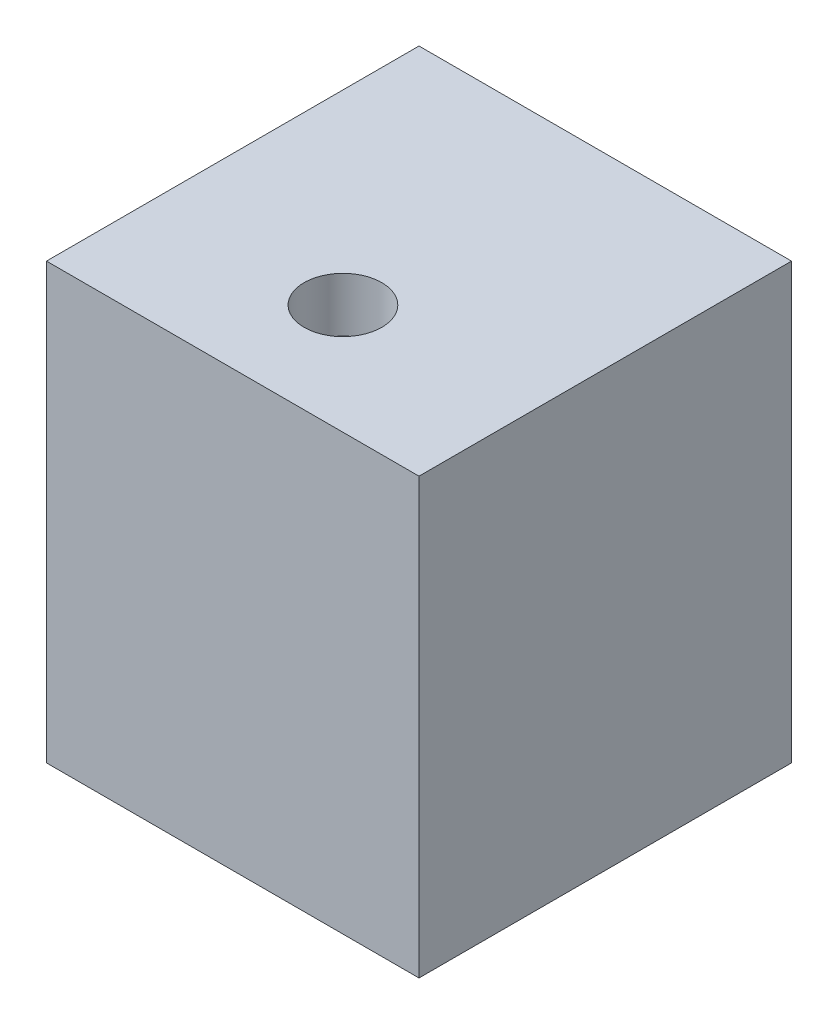
ISO-10303-21;
HEADER;
FILE_DESCRIPTION(('STEP AP214'),'2;1');
FILE_NAME('part.step','',(''),(''),'','','');
FILE_SCHEMA(('AUTOMOTIVE_DESIGN { 1 0 10303 214 1 1 1 1 }'));
ENDSEC;
DATA;
#1=APPLICATION_CONTEXT('core data for automotive mechanical design processes');
#2=APPLICATION_PROTOCOL_DEFINITION('international standard','automotive_design',2000,#1);
#3=PRODUCT_CONTEXT('',#1,'mechanical');
#4=PRODUCT('Part','Part','',(#3));
#5=PRODUCT_RELATED_PRODUCT_CATEGORY('part','',(#4));
#6=PRODUCT_DEFINITION_FORMATION('','',#4);
#7=PRODUCT_DEFINITION_CONTEXT('part definition',#1,'design');
#8=PRODUCT_DEFINITION('design','',#6,#7);
#9=PRODUCT_DEFINITION_SHAPE('','',#8);
#10=(LENGTH_UNIT() NAMED_UNIT(*) SI_UNIT(.MILLI.,.METRE.));
#11=(NAMED_UNIT(*) PLANE_ANGLE_UNIT() SI_UNIT($,.RADIAN.));
#12=(NAMED_UNIT(*) SI_UNIT($,.STERADIAN.) SOLID_ANGLE_UNIT());
#13=UNCERTAINTY_MEASURE_WITH_UNIT(LENGTH_MEASURE(1.E-05),#10,'distance_accuracy_value','');
#14=(GEOMETRIC_REPRESENTATION_CONTEXT(3) GLOBAL_UNCERTAINTY_ASSIGNED_CONTEXT((#13)) GLOBAL_UNIT_ASSIGNED_CONTEXT((#10,
#11,#12)) REPRESENTATION_CONTEXT('',''));
#15=CARTESIAN_POINT('',(0.,0.,0.));
#16=DIRECTION('',(0.,0.,1.));
#17=DIRECTION('',(1.,0.,0.));
#18=AXIS2_PLACEMENT_3D('',#15,#16,#17);
#19=CARTESIAN_POINT('',(-190.5,-58.2880193466019,15.875));
#20=DIRECTION('',(0.,0.,1.));
#21=DIRECTION('',(0.,-1.,0.));
#22=AXIS2_PLACEMENT_3D('',#19,#20,#21);
#23=PLANE('',#22);
#24=CARTESIAN_POINT('',(-171.45,-67.7452193466019,15.875));
#25=DIRECTION('',(0.,0.,1.));
#26=DIRECTION('',(0.,-1.,0.));
#27=AXIS2_PLACEMENT_3D('',#24,#25,#26);
#28=CIRCLE('',#27,2.09999999999999);
#29=CARTESIAN_POINT('',(-171.45,-69.8452193466019,15.875));
#30=VERTEX_POINT('',#29);
#31=EDGE_CURVE('E126',#30,#30,#28,.T.);
#32=ORIENTED_EDGE('',*,*,#31,.T.);
#33=EDGE_LOOP('',(#32));
#34=FACE_BOUND('',#33,.T.);
#35=CARTESIAN_POINT('',(-171.45,-93.7380193466019,15.875));
#36=DIRECTION('',(0.,0.,1.));
#37=DIRECTION('',(0.,-1.,0.));
#38=AXIS2_PLACEMENT_3D('',#35,#36,#37);
#39=CIRCLE('',#38,2.09999999999999);
#40=CARTESIAN_POINT('',(-171.45,-95.8380193466019,15.875));
#41=VERTEX_POINT('',#40);
#42=EDGE_CURVE('E129',#41,#41,#39,.T.);
#43=ORIENTED_EDGE('',*,*,#42,.T.);
#44=EDGE_LOOP('',(#43));
#45=FACE_BOUND('',#44,.T.);
#46=DIRECTION('',(0.,-1.,0.));
#47=VECTOR('',#46,1.);
#48=CARTESIAN_POINT('',(-152.4,-58.2880193466019,15.875));
#49=LINE('',#48,#47);
#50=CARTESIAN_POINT('',(-152.4,-58.2880193466019,15.875));
#51=VERTEX_POINT('',#50);
#52=CARTESIAN_POINT('',(-152.4,-102.738019346602,15.875));
#53=VERTEX_POINT('',#52);
#54=EDGE_CURVE('E104',#51,#53,#49,.T.);
#55=ORIENTED_EDGE('',*,*,#54,.T.);
#56=DIRECTION('',(1.,0.,0.));
#57=VECTOR('',#56,1.);
#58=CARTESIAN_POINT('',(-190.5,-102.738019346602,15.875));
#59=LINE('',#58,#57);
#60=CARTESIAN_POINT('',(-190.5,-102.738019346602,15.875));
#61=VERTEX_POINT('',#60);
#62=EDGE_CURVE('E11',#61,#53,#59,.T.);
#63=ORIENTED_EDGE('',*,*,#62,.F.);
#64=DIRECTION('',(0.,-1.,0.));
#65=VECTOR('',#64,1.);
#66=CARTESIAN_POINT('',(-190.5,-58.2880193466019,15.875));
#67=LINE('',#66,#65);
#68=CARTESIAN_POINT('',(-190.5,-58.2880193466019,15.875));
#69=VERTEX_POINT('',#68);
#70=EDGE_CURVE('E91',#69,#61,#67,.T.);
#71=ORIENTED_EDGE('',*,*,#70,.F.);
#72=DIRECTION('',(1.,0.,0.));
#73=VECTOR('',#72,1.);
#74=CARTESIAN_POINT('',(-190.5,-58.2880193466019,15.875));
#75=LINE('',#74,#73);
#76=EDGE_CURVE('E100',#69,#51,#75,.T.);
#77=ORIENTED_EDGE('',*,*,#76,.T.);
#78=EDGE_LOOP('',(#55,#63,#71,#77));
#79=FACE_BOUND('',#78,.T.);
#80=ADVANCED_FACE('F39',(#34,#45,#79),#23,.F.);
#81=CARTESIAN_POINT('',(-190.5,-102.738019346602,15.875));
#82=DIRECTION('',(0.,1.,0.));
#83=DIRECTION('',(0.,0.,1.));
#84=AXIS2_PLACEMENT_3D('',#81,#82,#83);
#85=PLANE('',#84);
#86=CARTESIAN_POINT('',(-171.45,-102.738019346602,42.70375));
#87=DIRECTION('',(0.,1.,0.));
#88=DIRECTION('',(0.,0.,1.));
#89=AXIS2_PLACEMENT_3D('',#86,#87,#88);
#90=CIRCLE('',#89,8.89000000000001);
#91=CARTESIAN_POINT('',(-171.45,-102.738019346602,51.59375));
#92=VERTEX_POINT('',#91);
#93=EDGE_CURVE('E42',#92,#92,#90,.T.);
#94=ORIENTED_EDGE('',*,*,#93,.T.);
#95=EDGE_LOOP('',(#94));
#96=FACE_BOUND('',#95,.T.);
#97=DIRECTION('',(0.,0.,1.));
#98=VECTOR('',#97,1.);
#99=CARTESIAN_POINT('',(-152.4,-102.738019346602,15.875));
#100=LINE('',#99,#98);
#101=CARTESIAN_POINT('',(-152.4,-102.738019346602,53.975));
#102=VERTEX_POINT('',#101);
#103=EDGE_CURVE('E95',#53,#102,#100,.T.);
#104=ORIENTED_EDGE('',*,*,#103,.T.);
#105=DIRECTION('',(1.,0.,0.));
#106=VECTOR('',#105,1.);
#107=CARTESIAN_POINT('',(-190.5,-102.738019346602,53.975));
#108=LINE('',#107,#106);
#109=CARTESIAN_POINT('',(-190.5,-102.738019346602,53.975));
#110=VERTEX_POINT('',#109);
#111=EDGE_CURVE('E48',#110,#102,#108,.T.);
#112=ORIENTED_EDGE('',*,*,#111,.F.);
#113=DIRECTION('',(0.,0.,1.));
#114=VECTOR('',#113,1.);
#115=CARTESIAN_POINT('',(-190.5,-102.738019346602,15.875));
#116=LINE('',#115,#114);
#117=EDGE_CURVE('E86',#61,#110,#116,.T.);
#118=ORIENTED_EDGE('',*,*,#117,.F.);
#119=ORIENTED_EDGE('',*,*,#62,.T.);
#120=EDGE_LOOP('',(#104,#112,#118,#119));
#121=FACE_BOUND('',#120,.T.);
#122=ADVANCED_FACE('F94',(#96,#121),#85,.F.);
#123=CARTESIAN_POINT('',(-190.5,-102.738019346602,53.975));
#124=DIRECTION('',(0.,0.,-1.));
#125=DIRECTION('',(-1.,0.,0.));
#126=AXIS2_PLACEMENT_3D('',#123,#124,#125);
#127=PLANE('',#126);
#128=DIRECTION('',(0.,1.,0.));
#129=VECTOR('',#128,1.);
#130=CARTESIAN_POINT('',(-152.4,-102.738019346602,53.975));
#131=LINE('',#130,#129);
#132=CARTESIAN_POINT('',(-152.4,-58.2880193466019,53.975));
#133=VERTEX_POINT('',#132);
#134=EDGE_CURVE('E73',#102,#133,#131,.T.);
#135=ORIENTED_EDGE('',*,*,#134,.T.);
#136=DIRECTION('',(1.,0.,0.));
#137=VECTOR('',#136,1.);
#138=CARTESIAN_POINT('',(-190.5,-58.2880193466019,53.975));
#139=LINE('',#138,#137);
#140=CARTESIAN_POINT('',(-190.5,-58.2880193466019,53.975));
#141=VERTEX_POINT('',#140);
#142=EDGE_CURVE('E96',#141,#133,#139,.T.);
#143=ORIENTED_EDGE('',*,*,#142,.F.);
#144=DIRECTION('',(0.,1.,0.));
#145=VECTOR('',#144,1.);
#146=CARTESIAN_POINT('',(-190.5,-102.738019346602,53.975));
#147=LINE('',#146,#145);
#148=EDGE_CURVE('E89',#110,#141,#147,.T.);
#149=ORIENTED_EDGE('',*,*,#148,.F.);
#150=ORIENTED_EDGE('',*,*,#111,.T.);
#151=EDGE_LOOP('',(#135,#143,#149,#150));
#152=FACE_BOUND('',#151,.T.);
#153=ADVANCED_FACE('F98',(#152),#127,.F.);
#154=CARTESIAN_POINT('',(-190.5,-58.2880193466019,53.975));
#155=DIRECTION('',(0.,-1.,0.));
#156=DIRECTION('',(0.,0.,-1.));
#157=AXIS2_PLACEMENT_3D('',#154,#155,#156);
#158=PLANE('',#157);
#159=CARTESIAN_POINT('',(-171.45,-58.2880193466019,42.70375));
#160=DIRECTION('',(0.,1.,0.));
#161=DIRECTION('',(0.,0.,1.));
#162=AXIS2_PLACEMENT_3D('',#159,#160,#161);
#163=CIRCLE('',#162,3.96874999999999);
#164=CARTESIAN_POINT('',(-171.45,-58.2880193466019,46.6725));
#165=VERTEX_POINT('',#164);
#166=EDGE_CURVE('E107',#165,#165,#163,.T.);
#167=ORIENTED_EDGE('',*,*,#166,.F.);
#168=EDGE_LOOP('',(#167));
#169=FACE_BOUND('',#168,.T.);
#170=DIRECTION('',(0.,0.,-1.));
#171=VECTOR('',#170,1.);
#172=CARTESIAN_POINT('',(-152.4,-58.2880193466019,53.975));
#173=LINE('',#172,#171);
#174=EDGE_CURVE('E79',#133,#51,#173,.T.);
#175=ORIENTED_EDGE('',*,*,#174,.T.);
#176=ORIENTED_EDGE('',*,*,#76,.F.);
#177=DIRECTION('',(0.,0.,-1.));
#178=VECTOR('',#177,1.);
#179=CARTESIAN_POINT('',(-190.5,-58.2880193466019,53.975));
#180=LINE('',#179,#178);
#181=EDGE_CURVE('E56',#141,#69,#180,.T.);
#182=ORIENTED_EDGE('',*,*,#181,.F.);
#183=ORIENTED_EDGE('',*,*,#142,.T.);
#184=EDGE_LOOP('',(#175,#176,#182,#183));
#185=FACE_BOUND('',#184,.T.);
#186=ADVANCED_FACE('F112',(#169,#185),#158,.F.);
#187=CARTESIAN_POINT('',(-190.5,0.,0.));
#188=DIRECTION('',(-1.,0.,0.));
#189=DIRECTION('',(0.,0.,1.));
#190=AXIS2_PLACEMENT_3D('',#187,#188,#189);
#191=PLANE('',#190);
#192=ORIENTED_EDGE('',*,*,#70,.T.);
#193=ORIENTED_EDGE('',*,*,#117,.T.);
#194=ORIENTED_EDGE('',*,*,#148,.T.);
#195=ORIENTED_EDGE('',*,*,#181,.T.);
#196=EDGE_LOOP('',(#192,#193,#194,#195));
#197=FACE_BOUND('',#196,.T.);
#198=ADVANCED_FACE('F87',(#197),#191,.T.);
#199=CARTESIAN_POINT('',(-152.4,0.,0.));
#200=DIRECTION('',(-1.,0.,0.));
#201=DIRECTION('',(0.,0.,1.));
#202=AXIS2_PLACEMENT_3D('',#199,#200,#201);
#203=PLANE('',#202);
#204=ORIENTED_EDGE('',*,*,#54,.F.);
#205=ORIENTED_EDGE('',*,*,#174,.F.);
#206=ORIENTED_EDGE('',*,*,#134,.F.);
#207=ORIENTED_EDGE('',*,*,#103,.F.);
#208=EDGE_LOOP('',(#204,#205,#206,#207));
#209=FACE_BOUND('',#208,.T.);
#210=ADVANCED_FACE('F115',(#209),#203,.F.);
#211=CARTESIAN_POINT('',(-171.45,-103.,42.70375));
#212=DIRECTION('',(0.,1.,0.));
#213=DIRECTION('',(0.,0.,1.));
#214=AXIS2_PLACEMENT_3D('',#211,#212,#213);
#215=CYLINDRICAL_SURFACE('',#214,3.96874999999999);
#216=CARTESIAN_POINT('',(-171.45,-63.8442693466019,42.70375));
#217=DIRECTION('',(0.,1.,0.));
#218=DIRECTION('',(0.,0.,1.));
#219=AXIS2_PLACEMENT_3D('',#216,#217,#218);
#220=CIRCLE('',#219,3.96874999999999);
#221=CARTESIAN_POINT('',(-171.45,-63.8442693466019,46.6725));
#222=VERTEX_POINT('',#221);
#223=EDGE_CURVE('E123',#222,#222,#220,.T.);
#224=ORIENTED_EDGE('',*,*,#223,.F.);
#225=EDGE_LOOP('',(#224));
#226=FACE_BOUND('',#225,.T.);
#227=ORIENTED_EDGE('',*,*,#166,.T.);
#228=EDGE_LOOP('',(#227));
#229=FACE_BOUND('',#228,.T.);
#230=ADVANCED_FACE('F186',(#226,#229),#215,.F.);
#231=CARTESIAN_POINT('',(-171.45,-103.,42.70375));
#232=DIRECTION('',(0.,1.,0.));
#233=DIRECTION('',(0.,0.,1.));
#234=AXIS2_PLACEMENT_3D('',#231,#232,#233);
#235=CYLINDRICAL_SURFACE('',#234,8.89000000000001);
#236=CARTESIAN_POINT('',(-173.55,-67.7452193466019,34.0653415817785));
#237=CARTESIAN_POINT('',(-173.549996359034,-67.8613976646451,34.0653392713239));
#238=CARTESIAN_POINT('',(-173.540326176896,-67.9776177901564,34.0629722852437));
#239=CARTESIAN_POINT('',(-173.501953718339,-68.2067353709698,34.0537811359784));
#240=CARTESIAN_POINT('',(-173.473239150367,-68.3196306311702,34.0469540942444));
#241=CARTESIAN_POINT('',(-173.397747044571,-68.5387512847129,34.0296582000622));
#242=CARTESIAN_POINT('',(-173.350991219847,-68.6449845179807,34.0191937268485));
#243=CARTESIAN_POINT('',(-173.240808261887,-68.8481065631369,33.9958074133476));
#244=CARTESIAN_POINT('',(-173.177380893648,-68.9449952432776,33.9828855384214));
#245=CARTESIAN_POINT('',(-173.034324006042,-69.1285839398915,33.9557561189713));
#246=CARTESIAN_POINT('',(-172.954427513979,-69.2150731985729,33.9415298624863));
#247=CARTESIAN_POINT('',(-172.781276006855,-69.3735561831119,33.9135576097844));
#248=CARTESIAN_POINT('',(-172.688019843569,-69.4455486617329,33.8998116549744));
#249=CARTESIAN_POINT('',(-172.489366253204,-69.5738437845948,33.8741432196586));
#250=CARTESIAN_POINT('',(-172.38383291731,-69.6299413452409,33.8622453969464));
#251=CARTESIAN_POINT('',(-172.164507607266,-69.7235238190543,33.8418263044772));
#252=CARTESIAN_POINT('',(-172.050716719789,-69.7610111762056,33.8333045913826));
#253=CARTESIAN_POINT('',(-171.820301140836,-69.8156395811259,33.8207301422928));
#254=CARTESIAN_POINT('',(-171.703765531236,-69.8331380095404,33.8165990042615));
#255=CARTESIAN_POINT('',(-171.469344520147,-69.8484116224043,33.8129986756684));
#256=CARTESIAN_POINT('',(-171.351459299711,-69.846189422137,33.8135288669368));
#257=CARTESIAN_POINT('',(-171.120157179806,-69.8223460661318,33.819132385048));
#258=CARTESIAN_POINT('',(-171.006698028811,-69.8011104091927,33.8241154262173));
#259=CARTESIAN_POINT('',(-170.785001173001,-69.7404601432542,33.8379606751245));
#260=CARTESIAN_POINT('',(-170.67676372866,-69.7010446284279,33.8468230761538));
#261=CARTESIAN_POINT('',(-170.46754234074,-69.6048284769625,33.8675726241646));
#262=CARTESIAN_POINT('',(-170.366625872158,-69.5478866022423,33.879484206995));
#263=CARTESIAN_POINT('',(-170.175643041462,-69.4183403649683,33.9050335217976));
#264=CARTESIAN_POINT('',(-170.085578386665,-69.3457335428457,33.9186715246977));
#265=CARTESIAN_POINT('',(-169.916559169076,-69.184836882801,33.9465709801316));
#266=CARTESIAN_POINT('',(-169.837926443309,-69.096209858554,33.9608395326454));
#267=CARTESIAN_POINT('',(-169.696573004814,-68.9068780412283,33.9880864694167));
#268=CARTESIAN_POINT('',(-169.633852881725,-68.8061728007956,34.0010648058545));
#269=CARTESIAN_POINT('',(-169.525928273954,-68.5949629344574,34.0242844883184));
#270=CARTESIAN_POINT('',(-169.480793606474,-68.4844213463279,34.0345148756253));
#271=CARTESIAN_POINT('',(-169.409843713971,-68.2570213061433,34.0509352763394));
#272=CARTESIAN_POINT('',(-169.384024851226,-68.1401640479573,34.0571260504938));
#273=CARTESIAN_POINT('',(-169.352957453177,-67.9064145363762,34.0646086005629));
#274=CARTESIAN_POINT('',(-169.347236367665,-67.7895886162042,34.0660128948972));
#275=CARTESIAN_POINT('',(-169.355239730758,-67.5566519631746,34.0640685145533));
#276=CARTESIAN_POINT('',(-169.368962600062,-67.440541173001,34.0607202258951));
#277=CARTESIAN_POINT('',(-169.415051899742,-67.214035095824,34.0497550647789));
#278=CARTESIAN_POINT('',(-169.447150037745,-67.1035819615123,34.0421996617293));
#279=CARTESIAN_POINT('',(-169.528784469781,-66.8896226111946,34.0237286094718));
#280=CARTESIAN_POINT('',(-169.578322654212,-66.7861171497238,34.0128125960099));
#281=CARTESIAN_POINT('',(-169.694443616052,-66.586969521013,33.9886086930485));
#282=CARTESIAN_POINT('',(-169.761312834452,-66.4914991660369,33.9752822059678));
#283=CARTESIAN_POINT('',(-169.909829814566,-66.3129610819661,33.9478567760563));
#284=CARTESIAN_POINT('',(-169.991479733136,-66.2298951662058,33.9337577206991));
#285=CARTESIAN_POINT('',(-170.169395409709,-66.0766463169933,33.9059991635173));
#286=CARTESIAN_POINT('',(-170.26594395958,-66.0067881571866,33.8923562291825));
#287=CARTESIAN_POINT('',(-170.469678289058,-65.8842799035749,33.8673714197724));
#288=CARTESIAN_POINT('',(-170.576863534108,-65.8316289455774,33.8560294291484));
#289=CARTESIAN_POINT('',(-170.798113561935,-65.7454600484278,33.8369932737506));
#290=CARTESIAN_POINT('',(-170.912124966985,-65.7118108263481,33.8292741429089));
#291=CARTESIAN_POINT('',(-171.144388230915,-65.6641983782714,33.8182447191271));
#292=CARTESIAN_POINT('',(-171.262639360888,-65.6502317848649,33.8149336720337));
#293=CARTESIAN_POINT('',(-171.496960126567,-65.6425533026843,33.8131204523518));
#294=CARTESIAN_POINT('',(-171.613013344568,-65.6483596657352,33.8145039001827));
#295=CARTESIAN_POINT('',(-171.842440184891,-65.6789706483074,33.8216745007631));
#296=CARTESIAN_POINT('',(-171.955813871751,-65.7037748097647,33.8274615473355));
#297=CARTESIAN_POINT('',(-172.176218747294,-65.7714309078372,33.8427755366242));
#298=CARTESIAN_POINT('',(-172.283275280174,-65.8142042093311,33.852286172274));
#299=CARTESIAN_POINT('',(-172.488750788094,-65.9165113024883,33.8740397036506));
#300=CARTESIAN_POINT('',(-172.587168780479,-65.9760469976803,33.8862829096539));
#301=CARTESIAN_POINT('',(-172.774888488817,-66.111704492483,33.9125067848131));
#302=CARTESIAN_POINT('',(-172.863945516368,-66.1881587206314,33.9265194386357));
#303=CARTESIAN_POINT('',(-173.028129874925,-66.3548260112809,33.9545466724927));
#304=CARTESIAN_POINT('',(-173.103253758033,-66.445042469346,33.9685612521474));
#305=CARTESIAN_POINT('',(-173.238623066928,-66.638429768027,33.9952612237393));
#306=CARTESIAN_POINT('',(-173.298608176967,-66.7417865435464,34.0079214492169));
#307=CARTESIAN_POINT('',(-173.400261048591,-66.9573976628903,34.0301516007288));
#308=CARTESIAN_POINT('',(-173.441943147842,-67.0696449606642,34.0397239440903));
#309=CARTESIAN_POINT('',(-173.499030659368,-67.2757411991995,34.0530718102036));
#310=CARTESIAN_POINT('',(-173.518104853574,-67.3685398108054,34.0576402663375));
#311=CARTESIAN_POINT('',(-173.543590583874,-67.5559562297474,34.0637759929628));
#312=CARTESIAN_POINT('',(-173.550002966137,-67.6505739150907,34.0653434640056));
#313=CARTESIAN_POINT('',(-173.55,-67.7452193466019,34.0653415817785));
#314=B_SPLINE_CURVE_WITH_KNOTS('',3,(#236,#237,#238,#239,#240,#241,#242,#243,#244,#245,#246,
#247,#248,#249,#250,#251,#252,#253,#254,#255,#256,#257,#258,#259,#260,#261,#262,#263,#264,#265,
#266,#267,#268,#269,#270,#271,#272,#273,#274,#275,#276,#277,#278,#279,#280,#281,#282,#283,#284,
#285,#286,#287,#288,#289,#290,#291,#292,#293,#294,#295,#296,#297,#298,#299,#300,#301,#302,#303,
#304,#305,#306,#307,#308,#309,#310,#311,#312,#313),.UNSPECIFIED.,.T.,.F.,(4,2,2,2,2,2,2,2,2,2,2,
2,2,2,2,2,2,2,2,2,2,2,2,2,2,2,2,2,2,2,2,2,2,2,2,2,2,2,4),(0.,0.348187718510768,
0.696600381944158,1.04459502344632,1.39259457056201,1.7467553498854,2.10094658657353,
2.45951885011868,2.81804401171745,3.17005355085058,3.52201640835982,3.867000859647,
4.21200250193698,4.55986058333225,4.90777332206497,5.26411066154846,5.62046120315756,
5.97821244059753,6.33589628623231,6.68511160960056,7.03429857021333,7.37851264305265,
7.72276403814798,8.07311479597546,8.42351671956065,8.78165171871791,9.13976872859557,
9.49538024914093,9.85093092237127,10.1978815601541,10.5448238327271,10.8902634044452,
11.2357422199347,11.5887313707127,11.941807756027,12.300595192478,12.6591010691655,
12.9427734439644,13.2264268607155),.UNSPECIFIED.);
#315=CARTESIAN_POINT('',(-173.55,-67.7452193466019,34.0653415817785));
#316=VERTEX_POINT('',#315);
#317=EDGE_CURVE('E132',#316,#316,#314,.T.);
#318=ORIENTED_EDGE('',*,*,#317,.F.);
#319=EDGE_LOOP('',(#318));
#320=FACE_BOUND('',#319,.T.);
#321=CARTESIAN_POINT('',(-173.55,-93.7380193466019,34.0653415817785));
#322=CARTESIAN_POINT('',(-173.549996359034,-93.8541976646451,34.0653392713239));
#323=CARTESIAN_POINT('',(-173.540326176896,-93.9704177901564,34.0629722852437));
#324=CARTESIAN_POINT('',(-173.501953718339,-94.1995353709698,34.0537811359784));
#325=CARTESIAN_POINT('',(-173.473239150367,-94.3124306311702,34.0469540942444));
#326=CARTESIAN_POINT('',(-173.397747044571,-94.5315512847129,34.0296582000622));
#327=CARTESIAN_POINT('',(-173.350991219847,-94.6377845179807,34.0191937268485));
#328=CARTESIAN_POINT('',(-173.240808261887,-94.8409065631369,33.9958074133476));
#329=CARTESIAN_POINT('',(-173.177380893648,-94.9377952432776,33.9828855384214));
#330=CARTESIAN_POINT('',(-173.034324006042,-95.1213839398915,33.9557561189713));
#331=CARTESIAN_POINT('',(-172.954427513979,-95.2078731985729,33.9415298624863));
#332=CARTESIAN_POINT('',(-172.781276006855,-95.3663561831119,33.9135576097844));
#333=CARTESIAN_POINT('',(-172.688019843569,-95.4383486617329,33.8998116549744));
#334=CARTESIAN_POINT('',(-172.489366253204,-95.5666437845949,33.8741432196586));
#335=CARTESIAN_POINT('',(-172.38383291731,-95.6227413452409,33.8622453969464));
#336=CARTESIAN_POINT('',(-172.164507607266,-95.7163238190543,33.8418263044772));
#337=CARTESIAN_POINT('',(-172.050716719789,-95.7538111762056,33.8333045913826));
#338=CARTESIAN_POINT('',(-171.820301140836,-95.8084395811259,33.8207301422928));
#339=CARTESIAN_POINT('',(-171.703765531236,-95.8259380095405,33.8165990042615));
#340=CARTESIAN_POINT('',(-171.469344520147,-95.8412116224043,33.8129986756684));
#341=CARTESIAN_POINT('',(-171.35145929971,-95.838989422137,33.8135288669368));
#342=CARTESIAN_POINT('',(-171.120157179806,-95.8151460661318,33.819132385048));
#343=CARTESIAN_POINT('',(-171.006698028811,-95.7939104091927,33.8241154262173));
#344=CARTESIAN_POINT('',(-170.785001173001,-95.7332601432542,33.8379606751245));
#345=CARTESIAN_POINT('',(-170.67676372866,-95.6938446284279,33.8468230761538));
#346=CARTESIAN_POINT('',(-170.46754234074,-95.5976284769625,33.8675726241646));
#347=CARTESIAN_POINT('',(-170.366625872158,-95.5406866022424,33.879484206995));
#348=CARTESIAN_POINT('',(-170.175643041462,-95.4111403649683,33.9050335217976));
#349=CARTESIAN_POINT('',(-170.085578386665,-95.3385335428457,33.9186715246977));
#350=CARTESIAN_POINT('',(-169.916559169076,-95.177636882801,33.9465709801316));
#351=CARTESIAN_POINT('',(-169.837926443309,-95.0890098585541,33.9608395326454));
#352=CARTESIAN_POINT('',(-169.696573004813,-94.8996780412283,33.9880864694167));
#353=CARTESIAN_POINT('',(-169.633852881725,-94.7989728007957,34.0010648058545));
#354=CARTESIAN_POINT('',(-169.525928273954,-94.5877629344574,34.0242844883184));
#355=CARTESIAN_POINT('',(-169.480793606474,-94.4772213463279,34.0345148756253));
#356=CARTESIAN_POINT('',(-169.409843713971,-94.2498213061433,34.0509352763394));
#357=CARTESIAN_POINT('',(-169.384024851226,-94.1329640479573,34.0571260504938));
#358=CARTESIAN_POINT('',(-169.352957453177,-93.8992145363762,34.0646086005629));
#359=CARTESIAN_POINT('',(-169.347236367665,-93.7823886162042,34.0660128948972));
#360=CARTESIAN_POINT('',(-169.355239730758,-93.5494519631746,34.0640685145533));
#361=CARTESIAN_POINT('',(-169.368962600062,-93.4333411730011,34.0607202258951));
#362=CARTESIAN_POINT('',(-169.415051899742,-93.206835095824,34.0497550647789));
#363=CARTESIAN_POINT('',(-169.447150037745,-93.0963819615123,34.0421996617293));
#364=CARTESIAN_POINT('',(-169.528784469781,-92.8824226111946,34.0237286094719));
#365=CARTESIAN_POINT('',(-169.578322654212,-92.7789171497238,34.0128125960099));
#366=CARTESIAN_POINT('',(-169.694443616052,-92.579769521013,33.9886086930485));
#367=CARTESIAN_POINT('',(-169.761312834452,-92.4842991660369,33.9752822059678));
#368=CARTESIAN_POINT('',(-169.909829814566,-92.3057610819661,33.9478567760563));
#369=CARTESIAN_POINT('',(-169.991479733136,-92.2226951662059,33.9337577206991));
#370=CARTESIAN_POINT('',(-170.169395409709,-92.0694463169933,33.9059991635173));
#371=CARTESIAN_POINT('',(-170.26594395958,-91.9995881571866,33.8923562291825));
#372=CARTESIAN_POINT('',(-170.469678289058,-91.8770799035749,33.8673714197724));
#373=CARTESIAN_POINT('',(-170.576863534108,-91.8244289455774,33.8560294291484));
#374=CARTESIAN_POINT('',(-170.798113561935,-91.7382600484279,33.8369932737506));
#375=CARTESIAN_POINT('',(-170.912124966985,-91.7046108263481,33.8292741429089));
#376=CARTESIAN_POINT('',(-171.144388230915,-91.6569983782714,33.8182447191271));
#377=CARTESIAN_POINT('',(-171.262639360888,-91.6430317848649,33.8149336720337));
#378=CARTESIAN_POINT('',(-171.496960126567,-91.6353533026843,33.8131204523518));
#379=CARTESIAN_POINT('',(-171.613013344568,-91.6411596657352,33.8145039001827));
#380=CARTESIAN_POINT('',(-171.842440184891,-91.6717706483074,33.8216745007631));
#381=CARTESIAN_POINT('',(-171.955813871751,-91.6965748097647,33.8274615473355));
#382=CARTESIAN_POINT('',(-172.176218747294,-91.7642309078372,33.8427755366242));
#383=CARTESIAN_POINT('',(-172.283275280174,-91.8070042093311,33.852286172274));
#384=CARTESIAN_POINT('',(-172.488750788094,-91.9093113024884,33.8740397036506));
#385=CARTESIAN_POINT('',(-172.587168780479,-91.9688469976803,33.8862829096539));
#386=CARTESIAN_POINT('',(-172.774888488817,-92.104504492483,33.9125067848131));
#387=CARTESIAN_POINT('',(-172.863945516368,-92.1809587206315,33.9265194386357));
#388=CARTESIAN_POINT('',(-173.028129874925,-92.3476260112809,33.9545466724927));
#389=CARTESIAN_POINT('',(-173.103253758033,-92.437842469346,33.9685612521474));
#390=CARTESIAN_POINT('',(-173.238623066927,-92.631229768027,33.9952612237392));
#391=CARTESIAN_POINT('',(-173.298608176967,-92.7345865435464,34.0079214492169));
#392=CARTESIAN_POINT('',(-173.400261048591,-92.9501976628903,34.0301516007288));
#393=CARTESIAN_POINT('',(-173.441943147842,-93.0624449606642,34.0397239440903));
#394=CARTESIAN_POINT('',(-173.499030659368,-93.2685411991995,34.0530718102036));
#395=CARTESIAN_POINT('',(-173.518104853574,-93.3613398108055,34.0576402663375));
#396=CARTESIAN_POINT('',(-173.543590583874,-93.5487562297475,34.0637759929628));
#397=CARTESIAN_POINT('',(-173.550002966137,-93.6433739150907,34.0653434640056));
#398=CARTESIAN_POINT('',(-173.55,-93.7380193466019,34.0653415817785));
#399=B_SPLINE_CURVE_WITH_KNOTS('',3,(#321,#322,#323,#324,#325,#326,#327,#328,#329,#330,#331,
#332,#333,#334,#335,#336,#337,#338,#339,#340,#341,#342,#343,#344,#345,#346,#347,#348,#349,#350,
#351,#352,#353,#354,#355,#356,#357,#358,#359,#360,#361,#362,#363,#364,#365,#366,#367,#368,#369,
#370,#371,#372,#373,#374,#375,#376,#377,#378,#379,#380,#381,#382,#383,#384,#385,#386,#387,#388,
#389,#390,#391,#392,#393,#394,#395,#396,#397,#398),.UNSPECIFIED.,.T.,.F.,(4,2,2,2,2,2,2,2,2,2,2,
2,2,2,2,2,2,2,2,2,2,2,2,2,2,2,2,2,2,2,2,2,2,2,2,2,2,2,4),(0.,0.348187718510768,
0.696600381944158,1.04459502344632,1.39259457056201,1.74675534988539,2.10094658657352,
2.45951885011868,2.81804401171745,3.17005355085055,3.52201640835981,3.86700085964699,
4.21200250193698,4.55986058333222,4.90777332206497,5.26411066154846,5.62046120315756,
5.97821244059754,6.33589628623231,6.68511160960055,7.03429857021333,7.37851264305262,
7.72276403814798,8.07311479597549,8.42351671956065,8.78165171871794,9.13976872859557,
9.49538024914096,9.85093092237127,10.1978815601541,10.5448238327271,10.8902634044453,
11.2357422199347,11.5887313707127,11.941807756027,12.300595192478,12.6591010691655,
12.9427734439644,13.2264268607155),.UNSPECIFIED.);
#400=CARTESIAN_POINT('',(-173.55,-93.7380193466019,34.0653415817785));
#401=VERTEX_POINT('',#400);
#402=EDGE_CURVE('E133',#401,#401,#399,.T.);
#403=ORIENTED_EDGE('',*,*,#402,.F.);
#404=EDGE_LOOP('',(#403));
#405=FACE_BOUND('',#404,.T.);
#406=CARTESIAN_POINT('',(-171.45,-63.8442693466019,42.70375));
#407=DIRECTION('',(0.,1.,0.));
#408=DIRECTION('',(0.,0.,1.));
#409=AXIS2_PLACEMENT_3D('',#406,#407,#408);
#410=CIRCLE('',#409,8.89000000000001);
#411=CARTESIAN_POINT('',(-171.45,-63.8442693466019,51.59375));
#412=VERTEX_POINT('',#411);
#413=EDGE_CURVE('E120',#412,#412,#410,.T.);
#414=ORIENTED_EDGE('',*,*,#413,.T.);
#415=EDGE_LOOP('',(#414));
#416=FACE_BOUND('',#415,.T.);
#417=ORIENTED_EDGE('',*,*,#93,.F.);
#418=EDGE_LOOP('',(#417));
#419=FACE_BOUND('',#418,.T.);
#420=ADVANCED_FACE('F191',(#320,#405,#416,#419),#235,.F.);
#421=CARTESIAN_POINT('',(0.,-63.8442693466019,0.));
#422=DIRECTION('',(0.,1.,0.));
#423=DIRECTION('',(0.,0.,1.));
#424=AXIS2_PLACEMENT_3D('',#421,#422,#423);
#425=PLANE('',#424);
#426=ORIENTED_EDGE('',*,*,#223,.T.);
#427=EDGE_LOOP('',(#426));
#428=FACE_BOUND('',#427,.T.);
#429=ORIENTED_EDGE('',*,*,#413,.F.);
#430=EDGE_LOOP('',(#429));
#431=FACE_BOUND('',#430,.T.);
#432=ADVANCED_FACE('F159',(#428,#431),#425,.F.);
#433=CARTESIAN_POINT('',(-171.45,-93.7380193466019,53.976));
#434=DIRECTION('',(0.,0.,-1.));
#435=DIRECTION('',(-1.,0.,0.));
#436=AXIS2_PLACEMENT_3D('',#433,#434,#435);
#437=CYLINDRICAL_SURFACE('',#436,2.09999999999999);
#438=ORIENTED_EDGE('',*,*,#402,.T.);
#439=EDGE_LOOP('',(#438));
#440=FACE_BOUND('',#439,.T.);
#441=ORIENTED_EDGE('',*,*,#42,.F.);
#442=EDGE_LOOP('',(#441));
#443=FACE_BOUND('',#442,.T.);
#444=ADVANCED_FACE('F146',(#440,#443),#437,.F.);
#445=CARTESIAN_POINT('',(-171.45,-67.7452193466019,53.976));
#446=DIRECTION('',(0.,0.,-1.));
#447=DIRECTION('',(-1.,0.,0.));
#448=AXIS2_PLACEMENT_3D('',#445,#446,#447);
#449=CYLINDRICAL_SURFACE('',#448,2.09999999999999);
#450=ORIENTED_EDGE('',*,*,#317,.T.);
#451=EDGE_LOOP('',(#450));
#452=FACE_BOUND('',#451,.T.);
#453=ORIENTED_EDGE('',*,*,#31,.F.);
#454=EDGE_LOOP('',(#453));
#455=FACE_BOUND('',#454,.T.);
#456=ADVANCED_FACE('F150',(#452,#455),#449,.F.);
#457=CLOSED_SHELL('',(#80,#122,#153,#186,#198,#210,#230,#420,#432,#444,#456));
#458=MANIFOLD_SOLID_BREP('B2',#457);
#459=ADVANCED_BREP_SHAPE_REPRESENTATION('',(#18,#458),#14);
#460=SHAPE_DEFINITION_REPRESENTATION(#9,#459);
ENDSEC;
END-ISO-10303-21;
